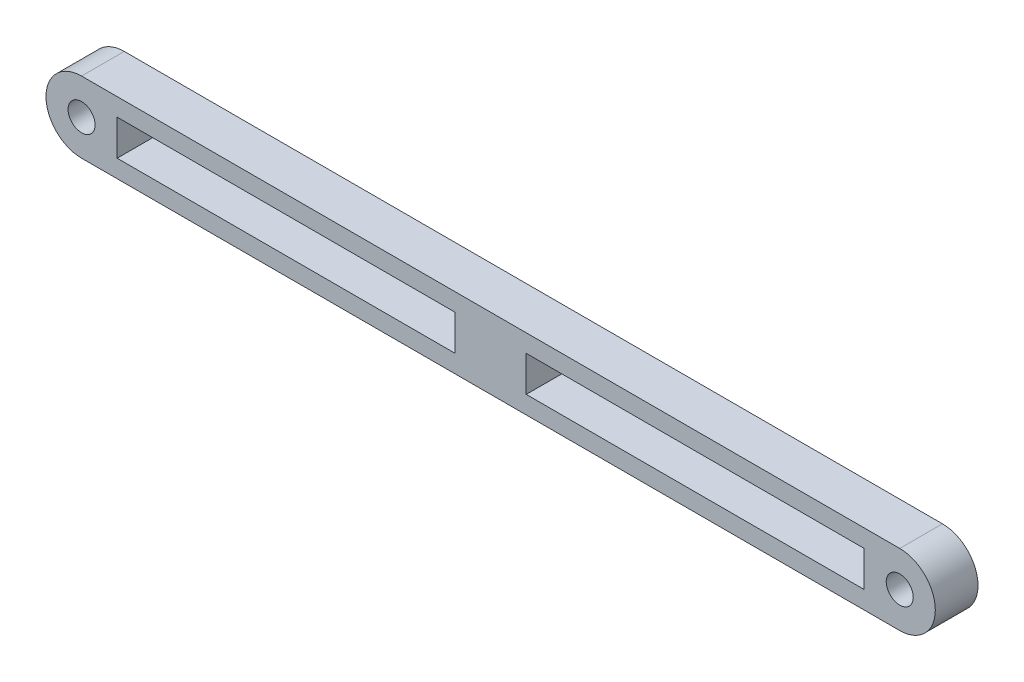
ISO-10303-21;
HEADER;
FILE_DESCRIPTION(('STEP AP214'),'2;1');
FILE_NAME('part.step','',(''),(''),'','','');
FILE_SCHEMA(('AUTOMOTIVE_DESIGN { 1 0 10303 214 1 1 1 1 }'));
ENDSEC;
DATA;
#1=APPLICATION_CONTEXT('core data for automotive mechanical design processes');
#2=APPLICATION_PROTOCOL_DEFINITION('international standard','automotive_design',2000,#1);
#3=PRODUCT_CONTEXT('',#1,'mechanical');
#4=PRODUCT('Part','Part','',(#3));
#5=PRODUCT_RELATED_PRODUCT_CATEGORY('part','',(#4));
#6=PRODUCT_DEFINITION_FORMATION('','',#4);
#7=PRODUCT_DEFINITION_CONTEXT('part definition',#1,'design');
#8=PRODUCT_DEFINITION('design','',#6,#7);
#9=PRODUCT_DEFINITION_SHAPE('','',#8);
#10=(LENGTH_UNIT() NAMED_UNIT(*) SI_UNIT(.MILLI.,.METRE.));
#11=(NAMED_UNIT(*) PLANE_ANGLE_UNIT() SI_UNIT($,.RADIAN.));
#12=(NAMED_UNIT(*) SI_UNIT($,.STERADIAN.) SOLID_ANGLE_UNIT());
#13=UNCERTAINTY_MEASURE_WITH_UNIT(LENGTH_MEASURE(1.E-05),#10,'distance_accuracy_value','');
#14=(GEOMETRIC_REPRESENTATION_CONTEXT(3) GLOBAL_UNCERTAINTY_ASSIGNED_CONTEXT((#13)) GLOBAL_UNIT_ASSIGNED_CONTEXT((#10,
#11,#12)) REPRESENTATION_CONTEXT('',''));
#15=CARTESIAN_POINT('',(0.,0.,0.));
#16=DIRECTION('',(0.,0.,1.));
#17=DIRECTION('',(1.,0.,0.));
#18=AXIS2_PLACEMENT_3D('',#15,#16,#17);
#19=CARTESIAN_POINT('',(57.5,0.,6.));
#20=DIRECTION('',(0.,0.,-1.));
#21=DIRECTION('',(-1.,0.,0.));
#22=AXIS2_PLACEMENT_3D('',#19,#20,#21);
#23=PLANE('',#22);
#24=DIRECTION('',(-1.,0.,0.));
#25=VECTOR('',#24,1.);
#26=CARTESIAN_POINT('',(-52.5,2.5,6.));
#27=LINE('',#26,#25);
#28=CARTESIAN_POINT('',(-5.,2.5,6.));
#29=VERTEX_POINT('',#28);
#30=CARTESIAN_POINT('',(-52.5,2.5,6.));
#31=VERTEX_POINT('',#30);
#32=EDGE_CURVE('E170',#29,#31,#27,.T.);
#33=ORIENTED_EDGE('',*,*,#32,.F.);
#34=DIRECTION('',(0.,1.,0.));
#35=VECTOR('',#34,1.);
#36=CARTESIAN_POINT('',(-5.,-2.5,6.));
#37=LINE('',#36,#35);
#38=CARTESIAN_POINT('',(-5.,-2.5,6.));
#39=VERTEX_POINT('',#38);
#40=EDGE_CURVE('E59',#39,#29,#37,.T.);
#41=ORIENTED_EDGE('',*,*,#40,.F.);
#42=DIRECTION('',(1.,0.,0.));
#43=VECTOR('',#42,1.);
#44=CARTESIAN_POINT('',(-52.5,-2.5,6.));
#45=LINE('',#44,#43);
#46=CARTESIAN_POINT('',(-52.5,-2.5,6.));
#47=VERTEX_POINT('',#46);
#48=EDGE_CURVE('E157',#47,#39,#45,.T.);
#49=ORIENTED_EDGE('',*,*,#48,.F.);
#50=DIRECTION('',(0.,-1.,0.));
#51=VECTOR('',#50,1.);
#52=CARTESIAN_POINT('',(-52.5,-2.5,6.));
#53=LINE('',#52,#51);
#54=EDGE_CURVE('E161',#31,#47,#53,.T.);
#55=ORIENTED_EDGE('',*,*,#54,.F.);
#56=EDGE_LOOP('',(#33,#41,#49,#55));
#57=FACE_BOUND('',#56,.T.);
#58=DIRECTION('',(-1.,0.,0.));
#59=VECTOR('',#58,1.);
#60=CARTESIAN_POINT('',(5.,2.50000000000001,6.));
#61=LINE('',#60,#59);
#62=CARTESIAN_POINT('',(52.5,2.50000000000001,6.));
#63=VERTEX_POINT('',#62);
#64=CARTESIAN_POINT('',(5.,2.50000000000001,6.));
#65=VERTEX_POINT('',#64);
#66=EDGE_CURVE('E207',#63,#65,#61,.T.);
#67=ORIENTED_EDGE('',*,*,#66,.F.);
#68=DIRECTION('',(0.,1.,0.));
#69=VECTOR('',#68,1.);
#70=CARTESIAN_POINT('',(52.5,-2.49999999999999,6.));
#71=LINE('',#70,#69);
#72=CARTESIAN_POINT('',(52.5,-2.49999999999999,6.));
#73=VERTEX_POINT('',#72);
#74=EDGE_CURVE('E67',#73,#63,#71,.T.);
#75=ORIENTED_EDGE('',*,*,#74,.F.);
#76=DIRECTION('',(1.,0.,0.));
#77=VECTOR('',#76,1.);
#78=CARTESIAN_POINT('',(5.,-2.49999999999999,6.));
#79=LINE('',#78,#77);
#80=CARTESIAN_POINT('',(5.,-2.49999999999999,6.));
#81=VERTEX_POINT('',#80);
#82=EDGE_CURVE('E198',#81,#73,#79,.T.);
#83=ORIENTED_EDGE('',*,*,#82,.F.);
#84=DIRECTION('',(0.,-1.,0.));
#85=VECTOR('',#84,1.);
#86=CARTESIAN_POINT('',(5.,-2.49999999999999,6.));
#87=LINE('',#86,#85);
#88=EDGE_CURVE('E202',#65,#81,#87,.T.);
#89=ORIENTED_EDGE('',*,*,#88,.F.);
#90=EDGE_LOOP('',(#67,#75,#83,#89));
#91=FACE_BOUND('',#90,.T.);
#92=CARTESIAN_POINT('',(57.5,0.,6.));
#93=DIRECTION('',(0.,0.,1.));
#94=DIRECTION('',(-1.,0.,0.));
#95=AXIS2_PLACEMENT_3D('',#92,#93,#94);
#96=CIRCLE('',#95,5.00000000000002);
#97=CARTESIAN_POINT('',(57.5,-5.00000000000002,6.));
#98=VERTEX_POINT('',#97);
#99=CARTESIAN_POINT('',(57.5,5.00000000000002,6.));
#100=VERTEX_POINT('',#99);
#101=EDGE_CURVE('E243',#98,#100,#96,.T.);
#102=ORIENTED_EDGE('',*,*,#101,.T.);
#103=DIRECTION('',(-1.,0.,0.));
#104=VECTOR('',#103,1.);
#105=CARTESIAN_POINT('',(-57.5,5.,6.));
#106=LINE('',#105,#104);
#107=CARTESIAN_POINT('',(-57.5,5.00000000000001,6.));
#108=VERTEX_POINT('',#107);
#109=EDGE_CURVE('E247',#100,#108,#106,.T.);
#110=ORIENTED_EDGE('',*,*,#109,.T.);
#111=CARTESIAN_POINT('',(-57.5,0.,6.));
#112=DIRECTION('',(0.,0.,1.));
#113=DIRECTION('',(1.,0.,0.));
#114=AXIS2_PLACEMENT_3D('',#111,#112,#113);
#115=CIRCLE('',#114,5.00000000000002);
#116=CARTESIAN_POINT('',(-57.5,-5.00000000000004,6.));
#117=VERTEX_POINT('',#116);
#118=EDGE_CURVE('E251',#108,#117,#115,.T.);
#119=ORIENTED_EDGE('',*,*,#118,.T.);
#120=DIRECTION('',(1.,0.,0.));
#121=VECTOR('',#120,1.);
#122=CARTESIAN_POINT('',(-57.5,-5.00000000000004,6.));
#123=LINE('',#122,#121);
#124=EDGE_CURVE('E254',#117,#98,#123,.T.);
#125=ORIENTED_EDGE('',*,*,#124,.T.);
#126=EDGE_LOOP('',(#102,#110,#119,#125));
#127=FACE_BOUND('',#126,.T.);
#128=CARTESIAN_POINT('',(-57.5,0.,6.));
#129=DIRECTION('',(0.,0.,1.));
#130=DIRECTION('',(1.,0.,0.));
#131=AXIS2_PLACEMENT_3D('',#128,#129,#130);
#132=CIRCLE('',#131,1.9);
#133=CARTESIAN_POINT('',(-55.6,0.,6.));
#134=VERTEX_POINT('',#133);
#135=EDGE_CURVE('E235',#134,#134,#132,.T.);
#136=ORIENTED_EDGE('',*,*,#135,.F.);
#137=EDGE_LOOP('',(#136));
#138=FACE_BOUND('',#137,.T.);
#139=CARTESIAN_POINT('',(57.5,0.,6.));
#140=DIRECTION('',(0.,0.,1.));
#141=DIRECTION('',(1.,0.,0.));
#142=AXIS2_PLACEMENT_3D('',#139,#140,#141);
#143=CIRCLE('',#142,1.9);
#144=CARTESIAN_POINT('',(59.4,0.,6.));
#145=VERTEX_POINT('',#144);
#146=EDGE_CURVE('E227',#145,#145,#143,.T.);
#147=ORIENTED_EDGE('',*,*,#146,.F.);
#148=EDGE_LOOP('',(#147));
#149=FACE_BOUND('',#148,.T.);
#150=ADVANCED_FACE('F43',(#57,#91,#127,#138,#149),#23,.F.);
#151=CARTESIAN_POINT('',(57.5,0.,0.));
#152=DIRECTION('',(0.,0.,-1.));
#153=DIRECTION('',(-1.,0.,0.));
#154=AXIS2_PLACEMENT_3D('',#151,#152,#153);
#155=PLANE('',#154);
#156=DIRECTION('',(0.,1.,0.));
#157=VECTOR('',#156,1.);
#158=CARTESIAN_POINT('',(-5.,-2.5,0.));
#159=LINE('',#158,#157);
#160=CARTESIAN_POINT('',(-5.,-2.5,0.));
#161=VERTEX_POINT('',#160);
#162=CARTESIAN_POINT('',(-5.,2.5,0.));
#163=VERTEX_POINT('',#162);
#164=EDGE_CURVE('E135',#161,#163,#159,.T.);
#165=ORIENTED_EDGE('',*,*,#164,.T.);
#166=DIRECTION('',(-1.,0.,0.));
#167=VECTOR('',#166,1.);
#168=CARTESIAN_POINT('',(-52.5,2.5,0.));
#169=LINE('',#168,#167);
#170=CARTESIAN_POINT('',(-52.5,2.5,0.));
#171=VERTEX_POINT('',#170);
#172=EDGE_CURVE('E146',#163,#171,#169,.T.);
#173=ORIENTED_EDGE('',*,*,#172,.T.);
#174=DIRECTION('',(0.,-1.,0.));
#175=VECTOR('',#174,1.);
#176=CARTESIAN_POINT('',(-52.5,-2.5,0.));
#177=LINE('',#176,#175);
#178=CARTESIAN_POINT('',(-52.5,-2.5,0.));
#179=VERTEX_POINT('',#178);
#180=EDGE_CURVE('E151',#171,#179,#177,.T.);
#181=ORIENTED_EDGE('',*,*,#180,.T.);
#182=DIRECTION('',(1.,0.,0.));
#183=VECTOR('',#182,1.);
#184=CARTESIAN_POINT('',(-52.5,-2.5,0.));
#185=LINE('',#184,#183);
#186=EDGE_CURVE('E142',#179,#161,#185,.T.);
#187=ORIENTED_EDGE('',*,*,#186,.T.);
#188=EDGE_LOOP('',(#165,#173,#181,#187));
#189=FACE_BOUND('',#188,.T.);
#190=DIRECTION('',(0.,1.,0.));
#191=VECTOR('',#190,1.);
#192=CARTESIAN_POINT('',(52.5,-2.49999999999999,0.));
#193=LINE('',#192,#191);
#194=CARTESIAN_POINT('',(52.5,-2.49999999999999,0.));
#195=VERTEX_POINT('',#194);
#196=CARTESIAN_POINT('',(52.5,2.50000000000001,0.));
#197=VERTEX_POINT('',#196);
#198=EDGE_CURVE('E203',#195,#197,#193,.T.);
#199=ORIENTED_EDGE('',*,*,#198,.T.);
#200=DIRECTION('',(-1.,0.,0.));
#201=VECTOR('',#200,1.);
#202=CARTESIAN_POINT('',(5.,2.50000000000001,0.));
#203=LINE('',#202,#201);
#204=CARTESIAN_POINT('',(5.,2.50000000000001,0.));
#205=VERTEX_POINT('',#204);
#206=EDGE_CURVE('E220',#197,#205,#203,.T.);
#207=ORIENTED_EDGE('',*,*,#206,.T.);
#208=DIRECTION('',(0.,-1.,0.));
#209=VECTOR('',#208,1.);
#210=CARTESIAN_POINT('',(5.,-2.49999999999999,0.));
#211=LINE('',#210,#209);
#212=CARTESIAN_POINT('',(5.,-2.49999999999999,0.));
#213=VERTEX_POINT('',#212);
#214=EDGE_CURVE('E216',#205,#213,#211,.T.);
#215=ORIENTED_EDGE('',*,*,#214,.T.);
#216=DIRECTION('',(1.,0.,0.));
#217=VECTOR('',#216,1.);
#218=CARTESIAN_POINT('',(5.,-2.49999999999999,0.));
#219=LINE('',#218,#217);
#220=EDGE_CURVE('E188',#213,#195,#219,.T.);
#221=ORIENTED_EDGE('',*,*,#220,.T.);
#222=EDGE_LOOP('',(#199,#207,#215,#221));
#223=FACE_BOUND('',#222,.T.);
#224=CARTESIAN_POINT('',(-57.5,0.,0.));
#225=DIRECTION('',(0.,0.,1.));
#226=DIRECTION('',(1.,0.,0.));
#227=AXIS2_PLACEMENT_3D('',#224,#225,#226);
#228=CIRCLE('',#227,1.9);
#229=CARTESIAN_POINT('',(-55.6,0.,0.));
#230=VERTEX_POINT('',#229);
#231=EDGE_CURVE('E231',#230,#230,#228,.T.);
#232=ORIENTED_EDGE('',*,*,#231,.T.);
#233=EDGE_LOOP('',(#232));
#234=FACE_BOUND('',#233,.T.);
#235=CARTESIAN_POINT('',(57.5,0.,0.));
#236=DIRECTION('',(0.,0.,1.));
#237=DIRECTION('',(-1.,0.,0.));
#238=AXIS2_PLACEMENT_3D('',#235,#236,#237);
#239=CIRCLE('',#238,5.00000000000002);
#240=CARTESIAN_POINT('',(57.5,-5.00000000000002,0.));
#241=VERTEX_POINT('',#240);
#242=CARTESIAN_POINT('',(57.5,5.00000000000002,0.));
#243=VERTEX_POINT('',#242);
#244=EDGE_CURVE('E239',#241,#243,#239,.T.);
#245=ORIENTED_EDGE('',*,*,#244,.F.);
#246=DIRECTION('',(1.,0.,0.));
#247=VECTOR('',#246,1.);
#248=CARTESIAN_POINT('',(-57.5,-5.00000000000004,0.));
#249=LINE('',#248,#247);
#250=CARTESIAN_POINT('',(-57.5,-5.00000000000004,0.));
#251=VERTEX_POINT('',#250);
#252=EDGE_CURVE('E248',#251,#241,#249,.T.);
#253=ORIENTED_EDGE('',*,*,#252,.F.);
#254=CARTESIAN_POINT('',(-57.5,0.,0.));
#255=DIRECTION('',(0.,0.,1.));
#256=DIRECTION('',(1.,0.,0.));
#257=AXIS2_PLACEMENT_3D('',#254,#255,#256);
#258=CIRCLE('',#257,5.00000000000002);
#259=CARTESIAN_POINT('',(-57.5,5.00000000000001,0.));
#260=VERTEX_POINT('',#259);
#261=EDGE_CURVE('E264',#260,#251,#258,.T.);
#262=ORIENTED_EDGE('',*,*,#261,.F.);
#263=DIRECTION('',(-1.,0.,0.));
#264=VECTOR('',#263,1.);
#265=CARTESIAN_POINT('',(-57.5,5.,0.));
#266=LINE('',#265,#264);
#267=EDGE_CURVE('E261',#243,#260,#266,.T.);
#268=ORIENTED_EDGE('',*,*,#267,.F.);
#269=EDGE_LOOP('',(#245,#253,#262,#268));
#270=FACE_BOUND('',#269,.T.);
#271=CARTESIAN_POINT('',(57.5,0.,0.));
#272=DIRECTION('',(0.,0.,1.));
#273=DIRECTION('',(1.,0.,0.));
#274=AXIS2_PLACEMENT_3D('',#271,#272,#273);
#275=CIRCLE('',#274,1.9);
#276=CARTESIAN_POINT('',(59.4,0.,0.));
#277=VERTEX_POINT('',#276);
#278=EDGE_CURVE('E179',#277,#277,#275,.T.);
#279=ORIENTED_EDGE('',*,*,#278,.T.);
#280=EDGE_LOOP('',(#279));
#281=FACE_BOUND('',#280,.T.);
#282=ADVANCED_FACE('F153',(#189,#223,#234,#270,#281),#155,.T.);
#283=CARTESIAN_POINT('',(57.5,0.,6.));
#284=DIRECTION('',(0.,0.,-1.));
#285=DIRECTION('',(-1.,0.,0.));
#286=AXIS2_PLACEMENT_3D('',#283,#284,#285);
#287=CYLINDRICAL_SURFACE('',#286,5.00000000000002);
#288=ORIENTED_EDGE('',*,*,#244,.T.);
#289=DIRECTION('',(0.,0.,-1.));
#290=VECTOR('',#289,1.);
#291=CARTESIAN_POINT('',(57.5,5.00000000000002,6.));
#292=LINE('',#291,#290);
#293=EDGE_CURVE('E11',#100,#243,#292,.T.);
#294=ORIENTED_EDGE('',*,*,#293,.F.);
#295=ORIENTED_EDGE('',*,*,#101,.F.);
#296=DIRECTION('',(0.,0.,-1.));
#297=VECTOR('',#296,1.);
#298=CARTESIAN_POINT('',(57.5,-5.00000000000002,6.));
#299=LINE('',#298,#297);
#300=EDGE_CURVE('E257',#98,#241,#299,.T.);
#301=ORIENTED_EDGE('',*,*,#300,.T.);
#302=EDGE_LOOP('',(#288,#294,#295,#301));
#303=FACE_BOUND('',#302,.T.);
#304=ADVANCED_FACE('F45',(#303),#287,.T.);
#305=CARTESIAN_POINT('',(-57.5,5.,6.));
#306=DIRECTION('',(0.,-1.,0.));
#307=DIRECTION('',(1.,0.,0.));
#308=AXIS2_PLACEMENT_3D('',#305,#306,#307);
#309=PLANE('',#308);
#310=ORIENTED_EDGE('',*,*,#267,.T.);
#311=DIRECTION('',(0.,0.,-1.));
#312=VECTOR('',#311,1.);
#313=CARTESIAN_POINT('',(-57.5,5.00000000000001,6.));
#314=LINE('',#313,#312);
#315=EDGE_CURVE('E52',#108,#260,#314,.T.);
#316=ORIENTED_EDGE('',*,*,#315,.F.);
#317=ORIENTED_EDGE('',*,*,#109,.F.);
#318=ORIENTED_EDGE('',*,*,#293,.T.);
#319=EDGE_LOOP('',(#310,#316,#317,#318));
#320=FACE_BOUND('',#319,.T.);
#321=ADVANCED_FACE('F297',(#320),#309,.F.);
#322=CARTESIAN_POINT('',(-57.5,0.,6.));
#323=DIRECTION('',(0.,0.,-1.));
#324=DIRECTION('',(-1.,0.,0.));
#325=AXIS2_PLACEMENT_3D('',#322,#323,#324);
#326=CYLINDRICAL_SURFACE('',#325,5.00000000000002);
#327=ORIENTED_EDGE('',*,*,#261,.T.);
#328=DIRECTION('',(0.,0.,-1.));
#329=VECTOR('',#328,1.);
#330=CARTESIAN_POINT('',(-57.5,-5.00000000000004,6.));
#331=LINE('',#330,#329);
#332=EDGE_CURVE('E272',#117,#251,#331,.T.);
#333=ORIENTED_EDGE('',*,*,#332,.F.);
#334=ORIENTED_EDGE('',*,*,#118,.F.);
#335=ORIENTED_EDGE('',*,*,#315,.T.);
#336=EDGE_LOOP('',(#327,#333,#334,#335));
#337=FACE_BOUND('',#336,.T.);
#338=ADVANCED_FACE('F281',(#337),#326,.T.);
#339=CARTESIAN_POINT('',(-57.5,-5.00000000000004,6.));
#340=DIRECTION('',(0.,1.,0.));
#341=DIRECTION('',(-1.,0.,0.));
#342=AXIS2_PLACEMENT_3D('',#339,#340,#341);
#343=PLANE('',#342);
#344=ORIENTED_EDGE('',*,*,#252,.T.);
#345=ORIENTED_EDGE('',*,*,#300,.F.);
#346=ORIENTED_EDGE('',*,*,#124,.F.);
#347=ORIENTED_EDGE('',*,*,#332,.T.);
#348=EDGE_LOOP('',(#344,#345,#346,#347));
#349=FACE_BOUND('',#348,.T.);
#350=ADVANCED_FACE('F290',(#349),#343,.F.);
#351=CARTESIAN_POINT('',(-57.5,0.,6.));
#352=DIRECTION('',(0.,0.,-1.));
#353=DIRECTION('',(-1.,0.,0.));
#354=AXIS2_PLACEMENT_3D('',#351,#352,#353);
#355=CYLINDRICAL_SURFACE('',#354,1.9);
#356=ORIENTED_EDGE('',*,*,#135,.T.);
#357=EDGE_LOOP('',(#356));
#358=FACE_BOUND('',#357,.T.);
#359=ORIENTED_EDGE('',*,*,#231,.F.);
#360=EDGE_LOOP('',(#359));
#361=FACE_BOUND('',#360,.T.);
#362=ADVANCED_FACE('F313',(#358,#361),#355,.F.);
#363=CARTESIAN_POINT('',(57.5,0.,6.));
#364=DIRECTION('',(0.,0.,-1.));
#365=DIRECTION('',(-1.,0.,0.));
#366=AXIS2_PLACEMENT_3D('',#363,#364,#365);
#367=CYLINDRICAL_SURFACE('',#366,1.9);
#368=ORIENTED_EDGE('',*,*,#146,.T.);
#369=EDGE_LOOP('',(#368));
#370=FACE_BOUND('',#369,.T.);
#371=ORIENTED_EDGE('',*,*,#278,.F.);
#372=EDGE_LOOP('',(#371));
#373=FACE_BOUND('',#372,.T.);
#374=ADVANCED_FACE('F320',(#370,#373),#367,.F.);
#375=CARTESIAN_POINT('',(52.5,-2.49999999999999,0.));
#376=DIRECTION('',(1.,0.,0.));
#377=DIRECTION('',(0.,0.,-1.));
#378=AXIS2_PLACEMENT_3D('',#375,#376,#377);
#379=PLANE('',#378);
#380=ORIENTED_EDGE('',*,*,#74,.T.);
#381=DIRECTION('',(0.,0.,1.));
#382=VECTOR('',#381,1.);
#383=CARTESIAN_POINT('',(52.5,2.50000000000001,0.));
#384=LINE('',#383,#382);
#385=EDGE_CURVE('E185',#197,#63,#384,.T.);
#386=ORIENTED_EDGE('',*,*,#385,.F.);
#387=ORIENTED_EDGE('',*,*,#198,.F.);
#388=DIRECTION('',(0.,0.,1.));
#389=VECTOR('',#388,1.);
#390=CARTESIAN_POINT('',(52.5,-2.49999999999999,0.));
#391=LINE('',#390,#389);
#392=EDGE_CURVE('E195',#195,#73,#391,.T.);
#393=ORIENTED_EDGE('',*,*,#392,.T.);
#394=EDGE_LOOP('',(#380,#386,#387,#393));
#395=FACE_BOUND('',#394,.T.);
#396=ADVANCED_FACE('F325',(#395),#379,.F.);
#397=CARTESIAN_POINT('',(5.,-2.49999999999999,0.));
#398=DIRECTION('',(0.,-1.,0.));
#399=DIRECTION('',(1.,0.,0.));
#400=AXIS2_PLACEMENT_3D('',#397,#398,#399);
#401=PLANE('',#400);
#402=ORIENTED_EDGE('',*,*,#82,.T.);
#403=ORIENTED_EDGE('',*,*,#392,.F.);
#404=ORIENTED_EDGE('',*,*,#220,.F.);
#405=DIRECTION('',(0.,0.,1.));
#406=VECTOR('',#405,1.);
#407=CARTESIAN_POINT('',(5.,-2.49999999999999,0.));
#408=LINE('',#407,#406);
#409=EDGE_CURVE('E192',#213,#81,#408,.T.);
#410=ORIENTED_EDGE('',*,*,#409,.T.);
#411=EDGE_LOOP('',(#402,#403,#404,#410));
#412=FACE_BOUND('',#411,.T.);
#413=ADVANCED_FACE('F338',(#412),#401,.F.);
#414=CARTESIAN_POINT('',(5.,-2.49999999999999,0.));
#415=DIRECTION('',(-1.,0.,0.));
#416=DIRECTION('',(0.,0.,1.));
#417=AXIS2_PLACEMENT_3D('',#414,#415,#416);
#418=PLANE('',#417);
#419=ORIENTED_EDGE('',*,*,#88,.T.);
#420=ORIENTED_EDGE('',*,*,#409,.F.);
#421=ORIENTED_EDGE('',*,*,#214,.F.);
#422=DIRECTION('',(0.,0.,1.));
#423=VECTOR('',#422,1.);
#424=CARTESIAN_POINT('',(5.,2.50000000000001,0.));
#425=LINE('',#424,#423);
#426=EDGE_CURVE('E189',#205,#65,#425,.T.);
#427=ORIENTED_EDGE('',*,*,#426,.T.);
#428=EDGE_LOOP('',(#419,#420,#421,#427));
#429=FACE_BOUND('',#428,.T.);
#430=ADVANCED_FACE('F343',(#429),#418,.F.);
#431=CARTESIAN_POINT('',(5.,2.50000000000001,0.));
#432=DIRECTION('',(0.,1.,0.));
#433=DIRECTION('',(-1.,0.,0.));
#434=AXIS2_PLACEMENT_3D('',#431,#432,#433);
#435=PLANE('',#434);
#436=ORIENTED_EDGE('',*,*,#66,.T.);
#437=ORIENTED_EDGE('',*,*,#426,.F.);
#438=ORIENTED_EDGE('',*,*,#206,.F.);
#439=ORIENTED_EDGE('',*,*,#385,.T.);
#440=EDGE_LOOP('',(#436,#437,#438,#439));
#441=FACE_BOUND('',#440,.T.);
#442=ADVANCED_FACE('F347',(#441),#435,.F.);
#443=CARTESIAN_POINT('',(-5.,-2.5,0.));
#444=DIRECTION('',(1.,0.,0.));
#445=DIRECTION('',(0.,0.,-1.));
#446=AXIS2_PLACEMENT_3D('',#443,#444,#445);
#447=PLANE('',#446);
#448=ORIENTED_EDGE('',*,*,#40,.T.);
#449=DIRECTION('',(0.,0.,1.));
#450=VECTOR('',#449,1.);
#451=CARTESIAN_POINT('',(-5.,2.5,0.));
#452=LINE('',#451,#450);
#453=EDGE_CURVE('E131',#163,#29,#452,.T.);
#454=ORIENTED_EDGE('',*,*,#453,.F.);
#455=ORIENTED_EDGE('',*,*,#164,.F.);
#456=DIRECTION('',(0.,0.,1.));
#457=VECTOR('',#456,1.);
#458=CARTESIAN_POINT('',(-5.,-2.5,0.));
#459=LINE('',#458,#457);
#460=EDGE_CURVE('E176',#161,#39,#459,.T.);
#461=ORIENTED_EDGE('',*,*,#460,.T.);
#462=EDGE_LOOP('',(#448,#454,#455,#461));
#463=FACE_BOUND('',#462,.T.);
#464=ADVANCED_FACE('F133',(#463),#447,.F.);
#465=CARTESIAN_POINT('',(-52.5,-2.5,0.));
#466=DIRECTION('',(0.,-1.,0.));
#467=DIRECTION('',(1.,0.,0.));
#468=AXIS2_PLACEMENT_3D('',#465,#466,#467);
#469=PLANE('',#468);
#470=ORIENTED_EDGE('',*,*,#48,.T.);
#471=ORIENTED_EDGE('',*,*,#460,.F.);
#472=ORIENTED_EDGE('',*,*,#186,.F.);
#473=DIRECTION('',(0.,0.,1.));
#474=VECTOR('',#473,1.);
#475=CARTESIAN_POINT('',(-52.5,-2.5,0.));
#476=LINE('',#475,#474);
#477=EDGE_CURVE('E180',#179,#47,#476,.T.);
#478=ORIENTED_EDGE('',*,*,#477,.T.);
#479=EDGE_LOOP('',(#470,#471,#472,#478));
#480=FACE_BOUND('',#479,.T.);
#481=ADVANCED_FACE('F354',(#480),#469,.F.);
#482=CARTESIAN_POINT('',(-52.5,-2.5,0.));
#483=DIRECTION('',(-1.,0.,0.));
#484=DIRECTION('',(0.,0.,1.));
#485=AXIS2_PLACEMENT_3D('',#482,#483,#484);
#486=PLANE('',#485);
#487=ORIENTED_EDGE('',*,*,#54,.T.);
#488=ORIENTED_EDGE('',*,*,#477,.F.);
#489=ORIENTED_EDGE('',*,*,#180,.F.);
#490=DIRECTION('',(0.,0.,1.));
#491=VECTOR('',#490,1.);
#492=CARTESIAN_POINT('',(-52.5,2.5,0.));
#493=LINE('',#492,#491);
#494=EDGE_CURVE('E141',#171,#31,#493,.T.);
#495=ORIENTED_EDGE('',*,*,#494,.T.);
#496=EDGE_LOOP('',(#487,#488,#489,#495));
#497=FACE_BOUND('',#496,.T.);
#498=ADVANCED_FACE('F357',(#497),#486,.F.);
#499=CARTESIAN_POINT('',(-52.5,2.5,0.));
#500=DIRECTION('',(0.,1.,0.));
#501=DIRECTION('',(-1.,0.,0.));
#502=AXIS2_PLACEMENT_3D('',#499,#500,#501);
#503=PLANE('',#502);
#504=ORIENTED_EDGE('',*,*,#32,.T.);
#505=ORIENTED_EDGE('',*,*,#494,.F.);
#506=ORIENTED_EDGE('',*,*,#172,.F.);
#507=ORIENTED_EDGE('',*,*,#453,.T.);
#508=EDGE_LOOP('',(#504,#505,#506,#507));
#509=FACE_BOUND('',#508,.T.);
#510=ADVANCED_FACE('F147',(#509),#503,.F.);
#511=CLOSED_SHELL('',(#150,#282,#304,#321,#338,#350,#362,#374,#396,#413,#430,#442,#464,#481,
#498,#510));
#512=MANIFOLD_SOLID_BREP('B2',#511);
#513=ADVANCED_BREP_SHAPE_REPRESENTATION('',(#18,#512),#14);
#514=SHAPE_DEFINITION_REPRESENTATION(#9,#513);
ENDSEC;
END-ISO-10303-21;
